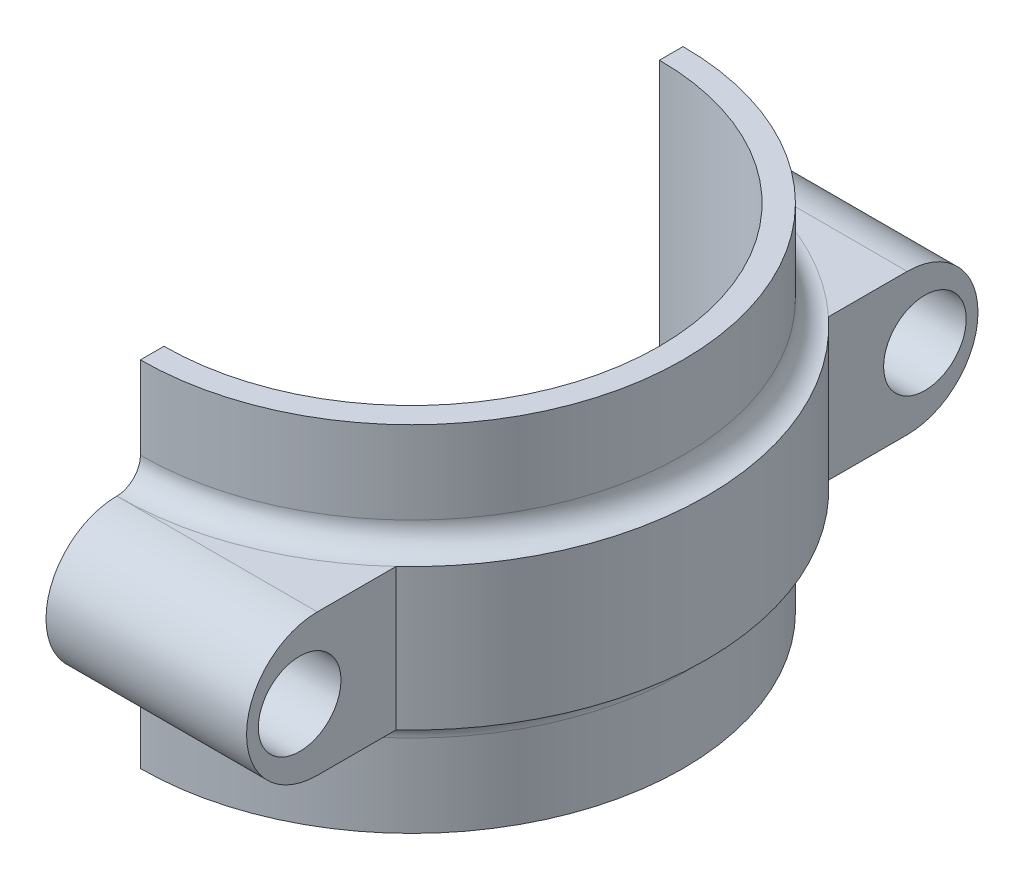
ISO-10303-21;
HEADER;
FILE_DESCRIPTION(('STEP AP214'),'2;1');
FILE_NAME('part.step','',(''),(''),'','','');
FILE_SCHEMA(('AUTOMOTIVE_DESIGN { 1 0 10303 214 1 1 1 1 }'));
ENDSEC;
DATA;
#1=APPLICATION_CONTEXT('core data for automotive mechanical design processes');
#2=APPLICATION_PROTOCOL_DEFINITION('international standard','automotive_design',2000,#1);
#3=PRODUCT_CONTEXT('',#1,'mechanical');
#4=PRODUCT('Part','Part','',(#3));
#5=PRODUCT_RELATED_PRODUCT_CATEGORY('part','',(#4));
#6=PRODUCT_DEFINITION_FORMATION('','',#4);
#7=PRODUCT_DEFINITION_CONTEXT('part definition',#1,'design');
#8=PRODUCT_DEFINITION('design','',#6,#7);
#9=PRODUCT_DEFINITION_SHAPE('','',#8);
#10=(LENGTH_UNIT() NAMED_UNIT(*) SI_UNIT(.MILLI.,.METRE.));
#11=(NAMED_UNIT(*) PLANE_ANGLE_UNIT() SI_UNIT($,.RADIAN.));
#12=(NAMED_UNIT(*) SI_UNIT($,.STERADIAN.) SOLID_ANGLE_UNIT());
#13=UNCERTAINTY_MEASURE_WITH_UNIT(LENGTH_MEASURE(1.E-05),#10,'distance_accuracy_value','');
#14=(GEOMETRIC_REPRESENTATION_CONTEXT(3) GLOBAL_UNCERTAINTY_ASSIGNED_CONTEXT((#13)) GLOBAL_UNIT_ASSIGNED_CONTEXT((#10,
#11,#12)) REPRESENTATION_CONTEXT('',''));
#15=CARTESIAN_POINT('',(0.,0.,0.));
#16=DIRECTION('',(0.,0.,1.));
#17=DIRECTION('',(1.,0.,0.));
#18=AXIS2_PLACEMENT_3D('',#15,#16,#17);
#19=CARTESIAN_POINT('',(0.,6.,0.));
#20=DIRECTION('',(0.,1.,0.));
#21=DIRECTION('',(0.,0.,1.));
#22=AXIS2_PLACEMENT_3D('',#19,#20,#21);
#23=PLANE('',#22);
#24=DIRECTION('',(1.,0.,0.));
#25=VECTOR('',#24,1.);
#26=CARTESIAN_POINT('',(0.,6.,-25.));
#27=LINE('',#26,#25);
#28=CARTESIAN_POINT('',(17.,6.,-25.));
#29=VERTEX_POINT('',#28);
#30=CARTESIAN_POINT('',(0.,6.,-25.));
#31=VERTEX_POINT('',#30);
#32=EDGE_CURVE('E188',#29,#31,#27,.F.);
#33=ORIENTED_EDGE('',*,*,#32,.T.);
#34=CARTESIAN_POINT('',(0.,6.,0.));
#35=DIRECTION('',(0.,1.,0.));
#36=DIRECTION('',(0.,0.,1.));
#37=AXIS2_PLACEMENT_3D('',#34,#35,#36);
#38=CIRCLE('',#37,25.);
#39=CARTESIAN_POINT('',(17.,6.,-18.3303027798234));
#40=VERTEX_POINT('',#39);
#41=EDGE_CURVE('E208',#31,#40,#38,.F.);
#42=ORIENTED_EDGE('',*,*,#41,.T.);
#43=DIRECTION('',(0.,0.,1.));
#44=VECTOR('',#43,1.);
#45=CARTESIAN_POINT('',(17.,6.,0.));
#46=LINE('',#45,#44);
#47=EDGE_CURVE('E163',#29,#40,#46,.T.);
#48=ORIENTED_EDGE('',*,*,#47,.F.);
#49=EDGE_LOOP('',(#33,#42,#48));
#50=FACE_BOUND('',#49,.T.);
#51=ADVANCED_FACE('F37',(#50),#23,.T.);
#52=CARTESIAN_POINT('',(0.,-6.,0.));
#53=DIRECTION('',(0.,1.,0.));
#54=DIRECTION('',(0.,0.,1.));
#55=AXIS2_PLACEMENT_3D('',#52,#53,#54);
#56=PLANE('',#55);
#57=DIRECTION('',(1.,0.,0.));
#58=VECTOR('',#57,1.);
#59=CARTESIAN_POINT('',(0.,-6.,25.));
#60=LINE('',#59,#58);
#61=CARTESIAN_POINT('',(17.,-6.,25.));
#62=VERTEX_POINT('',#61);
#63=CARTESIAN_POINT('',(0.,-6.,25.));
#64=VERTEX_POINT('',#63);
#65=EDGE_CURVE('E181',#62,#64,#60,.F.);
#66=ORIENTED_EDGE('',*,*,#65,.T.);
#67=CARTESIAN_POINT('',(0.,-6.,0.));
#68=DIRECTION('',(0.,1.,0.));
#69=DIRECTION('',(0.,0.,1.));
#70=AXIS2_PLACEMENT_3D('',#67,#68,#69);
#71=CIRCLE('',#70,25.);
#72=CARTESIAN_POINT('',(17.,-6.,18.3303027798234));
#73=VERTEX_POINT('',#72);
#74=EDGE_CURVE('E204',#64,#73,#71,.T.);
#75=ORIENTED_EDGE('',*,*,#74,.T.);
#76=DIRECTION('',(0.,0.,-1.));
#77=VECTOR('',#76,1.);
#78=CARTESIAN_POINT('',(17.,-6.,0.));
#79=LINE('',#78,#77);
#80=EDGE_CURVE('E164',#62,#73,#79,.T.);
#81=ORIENTED_EDGE('',*,*,#80,.F.);
#82=EDGE_LOOP('',(#66,#75,#81));
#83=FACE_BOUND('',#82,.T.);
#84=ADVANCED_FACE('F244',(#83),#56,.F.);
#85=CARTESIAN_POINT('',(17.,0.,-25.));
#86=DIRECTION('',(1.,0.,0.));
#87=DIRECTION('',(0.,0.,-1.));
#88=AXIS2_PLACEMENT_3D('',#85,#86,#87);
#89=CYLINDRICAL_SURFACE('',#88,6.);
#90=ORIENTED_EDGE('',*,*,#32,.F.);
#91=CARTESIAN_POINT('',(17.,0.,-25.));
#92=DIRECTION('',(1.,0.,0.));
#93=DIRECTION('',(0.,0.,-1.));
#94=AXIS2_PLACEMENT_3D('',#91,#92,#93);
#95=CIRCLE('',#94,6.);
#96=CARTESIAN_POINT('',(17.,-6.,-25.));
#97=VERTEX_POINT('',#96);
#98=EDGE_CURVE('E194',#97,#29,#95,.T.);
#99=ORIENTED_EDGE('',*,*,#98,.F.);
#100=DIRECTION('',(-1.,0.,0.));
#101=VECTOR('',#100,1.);
#102=CARTESIAN_POINT('',(17.,-6.,-25.));
#103=LINE('',#102,#101);
#104=CARTESIAN_POINT('',(0.,-6.,-25.));
#105=VERTEX_POINT('',#104);
#106=EDGE_CURVE('E191',#105,#97,#103,.F.);
#107=ORIENTED_EDGE('',*,*,#106,.F.);
#108=CARTESIAN_POINT('',(0.,0.,-25.));
#109=DIRECTION('',(-1.,0.,0.));
#110=DIRECTION('',(0.,0.,1.));
#111=AXIS2_PLACEMENT_3D('',#108,#109,#110);
#112=CIRCLE('',#111,6.);
#113=EDGE_CURVE('E196',#31,#105,#112,.T.);
#114=ORIENTED_EDGE('',*,*,#113,.F.);
#115=EDGE_LOOP('',(#90,#99,#107,#114));
#116=FACE_BOUND('',#115,.T.);
#117=ADVANCED_FACE('F281',(#116),#89,.T.);
#118=CARTESIAN_POINT('',(0.,0.,25.));
#119=DIRECTION('',(1.,0.,0.));
#120=DIRECTION('',(0.,0.,-1.));
#121=AXIS2_PLACEMENT_3D('',#118,#119,#120);
#122=CYLINDRICAL_SURFACE('',#121,6.);
#123=DIRECTION('',(-1.,0.,0.));
#124=VECTOR('',#123,1.);
#125=CARTESIAN_POINT('',(0.,6.,25.));
#126=LINE('',#125,#124);
#127=CARTESIAN_POINT('',(0.,6.,25.));
#128=VERTEX_POINT('',#127);
#129=CARTESIAN_POINT('',(17.,6.,25.));
#130=VERTEX_POINT('',#129);
#131=EDGE_CURVE('E178',#128,#130,#126,.F.);
#132=ORIENTED_EDGE('',*,*,#131,.F.);
#133=CARTESIAN_POINT('',(0.,0.,25.));
#134=DIRECTION('',(1.,0.,0.));
#135=DIRECTION('',(0.,0.,-1.));
#136=AXIS2_PLACEMENT_3D('',#133,#134,#135);
#137=CIRCLE('',#136,6.);
#138=EDGE_CURVE('E184',#64,#128,#137,.F.);
#139=ORIENTED_EDGE('',*,*,#138,.F.);
#140=ORIENTED_EDGE('',*,*,#65,.F.);
#141=CARTESIAN_POINT('',(17.,0.,25.));
#142=DIRECTION('',(-1.,0.,0.));
#143=DIRECTION('',(0.,0.,1.));
#144=AXIS2_PLACEMENT_3D('',#141,#142,#143);
#145=CIRCLE('',#144,6.);
#146=EDGE_CURVE('E186',#130,#62,#145,.F.);
#147=ORIENTED_EDGE('',*,*,#146,.F.);
#148=EDGE_LOOP('',(#132,#139,#140,#147));
#149=FACE_BOUND('',#148,.T.);
#150=ADVANCED_FACE('F241',(#149),#122,.T.);
#151=CARTESIAN_POINT('',(0.,6.,0.));
#152=DIRECTION('',(0.,-1.,0.));
#153=DIRECTION('',(0.,0.,-1.));
#154=AXIS2_PLACEMENT_3D('',#151,#152,#153);
#155=CYLINDRICAL_SURFACE('',#154,25.);
#156=CARTESIAN_POINT('',(0.,-6.,0.));
#157=DIRECTION('',(0.,1.,0.));
#158=DIRECTION('',(0.,0.,1.));
#159=AXIS2_PLACEMENT_3D('',#156,#157,#158);
#160=CIRCLE('',#159,25.);
#161=CARTESIAN_POINT('',(17.,-6.,-18.3303027798234));
#162=VERTEX_POINT('',#161);
#163=EDGE_CURVE('E151',#162,#73,#160,.F.);
#164=ORIENTED_EDGE('',*,*,#163,.F.);
#165=DIRECTION('',(0.,-1.,0.));
#166=VECTOR('',#165,1.);
#167=CARTESIAN_POINT('',(17.,6.,-18.3303027798234));
#168=LINE('',#167,#166);
#169=EDGE_CURVE('E175',#40,#162,#168,.T.);
#170=ORIENTED_EDGE('',*,*,#169,.F.);
#171=CARTESIAN_POINT('',(0.,6.,0.));
#172=DIRECTION('',(0.,1.,0.));
#173=DIRECTION('',(0.,0.,1.));
#174=AXIS2_PLACEMENT_3D('',#171,#172,#173);
#175=CIRCLE('',#174,25.);
#176=CARTESIAN_POINT('',(17.,6.,18.3303027798234));
#177=VERTEX_POINT('',#176);
#178=EDGE_CURVE('E160',#40,#177,#175,.F.);
#179=ORIENTED_EDGE('',*,*,#178,.T.);
#180=DIRECTION('',(0.,-1.,0.));
#181=VECTOR('',#180,1.);
#182=CARTESIAN_POINT('',(17.,6.,18.3303027798234));
#183=LINE('',#182,#181);
#184=EDGE_CURVE('E168',#177,#73,#183,.T.);
#185=ORIENTED_EDGE('',*,*,#184,.T.);
#186=EDGE_LOOP('',(#164,#170,#179,#185));
#187=FACE_BOUND('',#186,.T.);
#188=ADVANCED_FACE('F251',(#187),#155,.T.);
#189=CARTESIAN_POINT('',(17.,6.,0.));
#190=DIRECTION('',(1.,0.,0.));
#191=DIRECTION('',(0.,0.,-1.));
#192=AXIS2_PLACEMENT_3D('',#189,#190,#191);
#193=PLANE('',#192);
#194=CARTESIAN_POINT('',(17.,0.,-26.5));
#195=DIRECTION('',(1.,0.,0.));
#196=DIRECTION('',(0.,0.,-1.));
#197=AXIS2_PLACEMENT_3D('',#194,#195,#196);
#198=CIRCLE('',#197,3.5);
#199=CARTESIAN_POINT('',(17.,0.,-30.));
#200=VERTEX_POINT('',#199);
#201=EDGE_CURVE('E458',#200,#200,#198,.T.);
#202=ORIENTED_EDGE('',*,*,#201,.F.);
#203=EDGE_LOOP('',(#202));
#204=FACE_BOUND('',#203,.T.);
#205=DIRECTION('',(0.,0.,1.));
#206=VECTOR('',#205,1.);
#207=CARTESIAN_POINT('',(17.,-6.,0.));
#208=LINE('',#207,#206);
#209=EDGE_CURVE('E154',#97,#162,#208,.T.);
#210=ORIENTED_EDGE('',*,*,#209,.F.);
#211=ORIENTED_EDGE('',*,*,#98,.T.);
#212=ORIENTED_EDGE('',*,*,#47,.T.);
#213=ORIENTED_EDGE('',*,*,#169,.T.);
#214=EDGE_LOOP('',(#210,#211,#212,#213));
#215=FACE_BOUND('',#214,.T.);
#216=ADVANCED_FACE('F258',(#204,#215),#193,.T.);
#217=CARTESIAN_POINT('',(0.,6.,0.));
#218=DIRECTION('',(-1.,0.,0.));
#219=DIRECTION('',(0.,0.,1.));
#220=AXIS2_PLACEMENT_3D('',#217,#218,#219);
#221=PLANE('',#220);
#222=CARTESIAN_POINT('',(0.,0.,-26.5));
#223=DIRECTION('',(-1.,0.,0.));
#224=DIRECTION('',(0.,0.,1.));
#225=AXIS2_PLACEMENT_3D('',#222,#223,#224);
#226=CIRCLE('',#225,3.5);
#227=CARTESIAN_POINT('',(0.,0.,-23.));
#228=VERTEX_POINT('',#227);
#229=EDGE_CURVE('E461',#228,#228,#226,.T.);
#230=ORIENTED_EDGE('',*,*,#229,.F.);
#231=EDGE_LOOP('',(#230));
#232=FACE_BOUND('',#231,.T.);
#233=DIRECTION('',(0.,-1.,0.));
#234=VECTOR('',#233,1.);
#235=CARTESIAN_POINT('',(0.,15.,-23.));
#236=LINE('',#235,#234);
#237=CARTESIAN_POINT('',(0.,15.,-23.));
#238=VERTEX_POINT('',#237);
#239=CARTESIAN_POINT('',(0.,8.,-23.));
#240=VERTEX_POINT('',#239);
#241=EDGE_CURVE('E233',#238,#240,#236,.T.);
#242=ORIENTED_EDGE('',*,*,#241,.T.);
#243=CARTESIAN_POINT('',(0.,8.,-25.));
#244=DIRECTION('',(-1.,0.,0.));
#245=DIRECTION('',(0.,0.,1.));
#246=AXIS2_PLACEMENT_3D('',#243,#244,#245);
#247=CIRCLE('',#246,2.);
#248=EDGE_CURVE('E11',#240,#31,#247,.F.);
#249=ORIENTED_EDGE('',*,*,#248,.T.);
#250=ORIENTED_EDGE('',*,*,#113,.T.);
#251=CARTESIAN_POINT('',(0.,-8.,-25.));
#252=DIRECTION('',(-1.,0.,0.));
#253=DIRECTION('',(0.,0.,1.));
#254=AXIS2_PLACEMENT_3D('',#251,#252,#253);
#255=CIRCLE('',#254,2.);
#256=CARTESIAN_POINT('',(0.,-8.,-23.));
#257=VERTEX_POINT('',#256);
#258=EDGE_CURVE('E214',#105,#257,#255,.F.);
#259=ORIENTED_EDGE('',*,*,#258,.T.);
#260=CARTESIAN_POINT('',(0.,-15.,-23.));
#261=VERTEX_POINT('',#260);
#262=EDGE_CURVE('E221',#257,#261,#236,.T.);
#263=ORIENTED_EDGE('',*,*,#262,.T.);
#264=DIRECTION('',(0.,0.,-1.));
#265=VECTOR('',#264,1.);
#266=CARTESIAN_POINT('',(0.,-15.,0.));
#267=LINE('',#266,#265);
#268=CARTESIAN_POINT('',(0.,-15.,-21.));
#269=VERTEX_POINT('',#268);
#270=EDGE_CURVE('E146',#269,#261,#267,.T.);
#271=ORIENTED_EDGE('',*,*,#270,.F.);
#272=DIRECTION('',(0.,-1.,0.));
#273=VECTOR('',#272,1.);
#274=CARTESIAN_POINT('',(0.,15.,-21.));
#275=LINE('',#274,#273);
#276=CARTESIAN_POINT('',(0.,15.,-21.));
#277=VERTEX_POINT('',#276);
#278=EDGE_CURVE('E234',#277,#269,#275,.T.);
#279=ORIENTED_EDGE('',*,*,#278,.F.);
#280=DIRECTION('',(0.,0.,-1.));
#281=VECTOR('',#280,1.);
#282=CARTESIAN_POINT('',(0.,15.,0.));
#283=LINE('',#282,#281);
#284=EDGE_CURVE('E144',#277,#238,#283,.T.);
#285=ORIENTED_EDGE('',*,*,#284,.T.);
#286=EDGE_LOOP('',(#242,#249,#250,#259,#263,#271,#279,#285));
#287=FACE_BOUND('',#286,.T.);
#288=ADVANCED_FACE('F219',(#232,#287),#221,.T.);
#289=CARTESIAN_POINT('',(0.,6.,0.));
#290=DIRECTION('',(1.,0.,0.));
#291=DIRECTION('',(0.,0.,-1.));
#292=AXIS2_PLACEMENT_3D('',#289,#290,#291);
#293=PLANE('',#292);
#294=CARTESIAN_POINT('',(0.,0.,26.5));
#295=DIRECTION('',(-1.,0.,0.));
#296=DIRECTION('',(0.,0.,-1.));
#297=AXIS2_PLACEMENT_3D('',#294,#295,#296);
#298=CIRCLE('',#297,3.5);
#299=CARTESIAN_POINT('',(0.,0.,23.));
#300=VERTEX_POINT('',#299);
#301=EDGE_CURVE('E462',#300,#300,#298,.T.);
#302=ORIENTED_EDGE('',*,*,#301,.F.);
#303=EDGE_LOOP('',(#302));
#304=FACE_BOUND('',#303,.T.);
#305=DIRECTION('',(0.,-1.,0.));
#306=VECTOR('',#305,1.);
#307=CARTESIAN_POINT('',(0.,15.,23.));
#308=LINE('',#307,#306);
#309=CARTESIAN_POINT('',(0.,-8.,23.));
#310=VERTEX_POINT('',#309);
#311=CARTESIAN_POINT('',(0.,-15.,23.));
#312=VERTEX_POINT('',#311);
#313=EDGE_CURVE('E156',#310,#312,#308,.T.);
#314=ORIENTED_EDGE('',*,*,#313,.F.);
#315=CARTESIAN_POINT('',(0.,-8.,25.));
#316=DIRECTION('',(1.,0.,0.));
#317=DIRECTION('',(0.,0.,-1.));
#318=AXIS2_PLACEMENT_3D('',#315,#316,#317);
#319=CIRCLE('',#318,2.);
#320=EDGE_CURVE('E212',#310,#64,#319,.T.);
#321=ORIENTED_EDGE('',*,*,#320,.T.);
#322=ORIENTED_EDGE('',*,*,#138,.T.);
#323=CARTESIAN_POINT('',(0.,8.,25.));
#324=DIRECTION('',(1.,0.,0.));
#325=DIRECTION('',(0.,0.,-1.));
#326=AXIS2_PLACEMENT_3D('',#323,#324,#325);
#327=CIRCLE('',#326,2.);
#328=CARTESIAN_POINT('',(0.,8.,23.));
#329=VERTEX_POINT('',#328);
#330=EDGE_CURVE('E46',#128,#329,#327,.T.);
#331=ORIENTED_EDGE('',*,*,#330,.T.);
#332=CARTESIAN_POINT('',(0.,15.,23.));
#333=VERTEX_POINT('',#332);
#334=EDGE_CURVE('E133',#333,#329,#308,.T.);
#335=ORIENTED_EDGE('',*,*,#334,.F.);
#336=DIRECTION('',(0.,0.,1.));
#337=VECTOR('',#336,1.);
#338=CARTESIAN_POINT('',(0.,15.,0.));
#339=LINE('',#338,#337);
#340=CARTESIAN_POINT('',(0.,15.,21.));
#341=VERTEX_POINT('',#340);
#342=EDGE_CURVE('E125',#341,#333,#339,.T.);
#343=ORIENTED_EDGE('',*,*,#342,.F.);
#344=DIRECTION('',(0.,-1.,0.));
#345=VECTOR('',#344,1.);
#346=CARTESIAN_POINT('',(0.,15.,21.));
#347=LINE('',#346,#345);
#348=CARTESIAN_POINT('',(0.,-15.,21.));
#349=VERTEX_POINT('',#348);
#350=EDGE_CURVE('E131',#341,#349,#347,.T.);
#351=ORIENTED_EDGE('',*,*,#350,.T.);
#352=DIRECTION('',(0.,0.,1.));
#353=VECTOR('',#352,1.);
#354=CARTESIAN_POINT('',(0.,-15.,0.));
#355=LINE('',#354,#353);
#356=EDGE_CURVE('E472',#349,#312,#355,.T.);
#357=ORIENTED_EDGE('',*,*,#356,.T.);
#358=EDGE_LOOP('',(#314,#321,#322,#331,#335,#343,#351,#357));
#359=FACE_BOUND('',#358,.T.);
#360=ADVANCED_FACE('F128',(#304,#359),#293,.F.);
#361=CARTESIAN_POINT('',(17.,6.,0.));
#362=DIRECTION('',(-1.,0.,0.));
#363=DIRECTION('',(0.,0.,1.));
#364=AXIS2_PLACEMENT_3D('',#361,#362,#363);
#365=PLANE('',#364);
#366=CARTESIAN_POINT('',(17.,0.,26.5));
#367=DIRECTION('',(-1.,0.,0.));
#368=DIRECTION('',(0.,0.,1.));
#369=AXIS2_PLACEMENT_3D('',#366,#367,#368);
#370=CIRCLE('',#369,3.5);
#371=CARTESIAN_POINT('',(17.,0.,30.));
#372=VERTEX_POINT('',#371);
#373=EDGE_CURVE('E41',#372,#372,#370,.T.);
#374=ORIENTED_EDGE('',*,*,#373,.T.);
#375=EDGE_LOOP('',(#374));
#376=FACE_BOUND('',#375,.T.);
#377=DIRECTION('',(0.,0.,-1.));
#378=VECTOR('',#377,1.);
#379=CARTESIAN_POINT('',(17.,6.,0.));
#380=LINE('',#379,#378);
#381=EDGE_CURVE('E167',#130,#177,#380,.T.);
#382=ORIENTED_EDGE('',*,*,#381,.F.);
#383=ORIENTED_EDGE('',*,*,#146,.T.);
#384=ORIENTED_EDGE('',*,*,#80,.T.);
#385=ORIENTED_EDGE('',*,*,#184,.F.);
#386=EDGE_LOOP('',(#382,#383,#384,#385));
#387=FACE_BOUND('',#386,.T.);
#388=ADVANCED_FACE('F248',(#376,#387),#365,.F.);
#389=ORIENTED_EDGE('',*,*,#381,.T.);
#390=CARTESIAN_POINT('',(0.,6.,0.));
#391=DIRECTION('',(0.,1.,0.));
#392=DIRECTION('',(0.,0.,1.));
#393=AXIS2_PLACEMENT_3D('',#390,#391,#392);
#394=CIRCLE('',#393,25.);
#395=EDGE_CURVE('E206',#177,#128,#394,.F.);
#396=ORIENTED_EDGE('',*,*,#395,.T.);
#397=ORIENTED_EDGE('',*,*,#131,.T.);
#398=EDGE_LOOP('',(#389,#396,#397));
#399=FACE_BOUND('',#398,.T.);
#400=ADVANCED_FACE('F266',(#399),#23,.T.);
#401=ORIENTED_EDGE('',*,*,#209,.T.);
#402=CARTESIAN_POINT('',(0.,-6.,0.));
#403=DIRECTION('',(0.,1.,0.));
#404=DIRECTION('',(0.,0.,1.));
#405=AXIS2_PLACEMENT_3D('',#402,#403,#404);
#406=CIRCLE('',#405,25.);
#407=EDGE_CURVE('E202',#162,#105,#406,.T.);
#408=ORIENTED_EDGE('',*,*,#407,.T.);
#409=ORIENTED_EDGE('',*,*,#106,.T.);
#410=EDGE_LOOP('',(#401,#408,#409));
#411=FACE_BOUND('',#410,.T.);
#412=ADVANCED_FACE('F255',(#411),#56,.F.);
#413=CARTESIAN_POINT('',(0.,15.,0.));
#414=DIRECTION('',(0.,-1.,0.));
#415=DIRECTION('',(0.,0.,-1.));
#416=AXIS2_PLACEMENT_3D('',#413,#414,#415);
#417=CYLINDRICAL_SURFACE('',#416,23.);
#418=ORIENTED_EDGE('',*,*,#262,.F.);
#419=CARTESIAN_POINT('',(0.,-8.,0.));
#420=DIRECTION('',(0.,1.,0.));
#421=DIRECTION('',(0.,0.,1.));
#422=AXIS2_PLACEMENT_3D('',#419,#420,#421);
#423=CIRCLE('',#422,23.);
#424=EDGE_CURVE('E199',#257,#310,#423,.F.);
#425=ORIENTED_EDGE('',*,*,#424,.T.);
#426=ORIENTED_EDGE('',*,*,#313,.T.);
#427=CARTESIAN_POINT('',(0.,-15.,0.));
#428=DIRECTION('',(0.,1.,0.));
#429=DIRECTION('',(0.,0.,1.));
#430=AXIS2_PLACEMENT_3D('',#427,#428,#429);
#431=CIRCLE('',#430,23.);
#432=EDGE_CURVE('E231',#261,#312,#431,.F.);
#433=ORIENTED_EDGE('',*,*,#432,.F.);
#434=EDGE_LOOP('',(#418,#425,#426,#433));
#435=FACE_BOUND('',#434,.T.);
#436=ADVANCED_FACE('F229',(#435),#417,.T.);
#437=CARTESIAN_POINT('',(0.,15.,0.));
#438=DIRECTION('',(0.,-1.,0.));
#439=DIRECTION('',(0.,0.,-1.));
#440=AXIS2_PLACEMENT_3D('',#437,#438,#439);
#441=CYLINDRICAL_SURFACE('',#440,21.);
#442=CARTESIAN_POINT('',(0.,-15.,0.));
#443=DIRECTION('',(0.,1.,0.));
#444=DIRECTION('',(0.,0.,1.));
#445=AXIS2_PLACEMENT_3D('',#442,#443,#444);
#446=CIRCLE('',#445,21.);
#447=EDGE_CURVE('E150',#269,#349,#446,.F.);
#448=ORIENTED_EDGE('',*,*,#447,.T.);
#449=ORIENTED_EDGE('',*,*,#350,.F.);
#450=CARTESIAN_POINT('',(0.,15.,0.));
#451=DIRECTION('',(0.,1.,0.));
#452=DIRECTION('',(0.,0.,1.));
#453=AXIS2_PLACEMENT_3D('',#450,#451,#452);
#454=CIRCLE('',#453,21.);
#455=EDGE_CURVE('E138',#277,#341,#454,.F.);
#456=ORIENTED_EDGE('',*,*,#455,.F.);
#457=ORIENTED_EDGE('',*,*,#278,.T.);
#458=EDGE_LOOP('',(#448,#449,#456,#457));
#459=FACE_BOUND('',#458,.T.);
#460=ADVANCED_FACE('F148',(#459),#441,.F.);
#461=ORIENTED_EDGE('',*,*,#334,.T.);
#462=CARTESIAN_POINT('',(0.,8.,0.));
#463=DIRECTION('',(0.,1.,0.));
#464=DIRECTION('',(0.,0.,1.));
#465=AXIS2_PLACEMENT_3D('',#462,#463,#464);
#466=CIRCLE('',#465,23.);
#467=EDGE_CURVE('E53',#329,#240,#466,.T.);
#468=ORIENTED_EDGE('',*,*,#467,.T.);
#469=ORIENTED_EDGE('',*,*,#241,.F.);
#470=CARTESIAN_POINT('',(0.,15.,0.));
#471=DIRECTION('',(0.,1.,0.));
#472=DIRECTION('',(0.,0.,1.));
#473=AXIS2_PLACEMENT_3D('',#470,#471,#472);
#474=CIRCLE('',#473,23.);
#475=EDGE_CURVE('E137',#238,#333,#474,.F.);
#476=ORIENTED_EDGE('',*,*,#475,.T.);
#477=EDGE_LOOP('',(#461,#468,#469,#476));
#478=FACE_BOUND('',#477,.T.);
#479=ADVANCED_FACE('F318',(#478),#417,.T.);
#480=CARTESIAN_POINT('',(0.,15.,0.));
#481=DIRECTION('',(0.,1.,0.));
#482=DIRECTION('',(0.,0.,1.));
#483=AXIS2_PLACEMENT_3D('',#480,#481,#482);
#484=PLANE('',#483);
#485=ORIENTED_EDGE('',*,*,#455,.T.);
#486=ORIENTED_EDGE('',*,*,#342,.T.);
#487=ORIENTED_EDGE('',*,*,#475,.F.);
#488=ORIENTED_EDGE('',*,*,#284,.F.);
#489=EDGE_LOOP('',(#485,#486,#487,#488));
#490=FACE_BOUND('',#489,.T.);
#491=ADVANCED_FACE('F142',(#490),#484,.T.);
#492=CARTESIAN_POINT('',(0.,-15.,0.));
#493=DIRECTION('',(0.,1.,0.));
#494=DIRECTION('',(0.,0.,1.));
#495=AXIS2_PLACEMENT_3D('',#492,#493,#494);
#496=PLANE('',#495);
#497=ORIENTED_EDGE('',*,*,#447,.F.);
#498=ORIENTED_EDGE('',*,*,#270,.T.);
#499=ORIENTED_EDGE('',*,*,#432,.T.);
#500=ORIENTED_EDGE('',*,*,#356,.F.);
#501=EDGE_LOOP('',(#497,#498,#499,#500));
#502=FACE_BOUND('',#501,.T.);
#503=ADVANCED_FACE('F307',(#502),#496,.F.);
#504=CARTESIAN_POINT('',(0.,-8.,0.));
#505=DIRECTION('',(0.,1.,0.));
#506=DIRECTION('',(0.,0.,1.));
#507=AXIS2_PLACEMENT_3D('',#504,#505,#506);
#508=TOROIDAL_SURFACE('',#507,25.,2.);
#509=ORIENTED_EDGE('',*,*,#163,.T.);
#510=ORIENTED_EDGE('',*,*,#74,.F.);
#511=ORIENTED_EDGE('',*,*,#320,.F.);
#512=ORIENTED_EDGE('',*,*,#424,.F.);
#513=ORIENTED_EDGE('',*,*,#258,.F.);
#514=ORIENTED_EDGE('',*,*,#407,.F.);
#515=EDGE_LOOP('',(#509,#510,#511,#512,#513,#514));
#516=FACE_BOUND('',#515,.T.);
#517=ADVANCED_FACE('F235',(#516),#508,.F.);
#518=CARTESIAN_POINT('',(0.,8.,0.));
#519=DIRECTION('',(0.,1.,0.));
#520=DIRECTION('',(0.,0.,1.));
#521=AXIS2_PLACEMENT_3D('',#518,#519,#520);
#522=TOROIDAL_SURFACE('',#521,25.,2.);
#523=ORIENTED_EDGE('',*,*,#248,.F.);
#524=ORIENTED_EDGE('',*,*,#467,.F.);
#525=ORIENTED_EDGE('',*,*,#330,.F.);
#526=ORIENTED_EDGE('',*,*,#395,.F.);
#527=ORIENTED_EDGE('',*,*,#178,.F.);
#528=ORIENTED_EDGE('',*,*,#41,.F.);
#529=EDGE_LOOP('',(#523,#524,#525,#526,#527,#528));
#530=FACE_BOUND('',#529,.T.);
#531=ADVANCED_FACE('F39',(#530),#522,.F.);
#532=CARTESIAN_POINT('',(25.,0.,26.5));
#533=DIRECTION('',(-1.,0.,0.));
#534=DIRECTION('',(0.,0.,1.));
#535=AXIS2_PLACEMENT_3D('',#532,#533,#534);
#536=CYLINDRICAL_SURFACE('',#535,3.5);
#537=ORIENTED_EDGE('',*,*,#301,.T.);
#538=EDGE_LOOP('',(#537));
#539=FACE_BOUND('',#538,.T.);
#540=ORIENTED_EDGE('',*,*,#373,.F.);
#541=EDGE_LOOP('',(#540));
#542=FACE_BOUND('',#541,.T.);
#543=ADVANCED_FACE('F312',(#539,#542),#536,.F.);
#544=CARTESIAN_POINT('',(25.,0.,-26.5));
#545=DIRECTION('',(-1.,0.,0.));
#546=DIRECTION('',(0.,0.,1.));
#547=AXIS2_PLACEMENT_3D('',#544,#545,#546);
#548=CYLINDRICAL_SURFACE('',#547,3.5);
#549=ORIENTED_EDGE('',*,*,#201,.T.);
#550=EDGE_LOOP('',(#549));
#551=FACE_BOUND('',#550,.T.);
#552=ORIENTED_EDGE('',*,*,#229,.T.);
#553=EDGE_LOOP('',(#552));
#554=FACE_BOUND('',#553,.T.);
#555=ADVANCED_FACE('F442',(#551,#554),#548,.F.);
#556=CLOSED_SHELL('',(#51,#84,#117,#150,#188,#216,#288,#360,#388,#400,#412,#436,#460,#479,#491,
#503,#517,#531,#543,#555));
#557=MANIFOLD_SOLID_BREP('B2',#556);
#558=ADVANCED_BREP_SHAPE_REPRESENTATION('',(#18,#557),#14);
#559=SHAPE_DEFINITION_REPRESENTATION(#9,#558);
ENDSEC;
END-ISO-10303-21;
